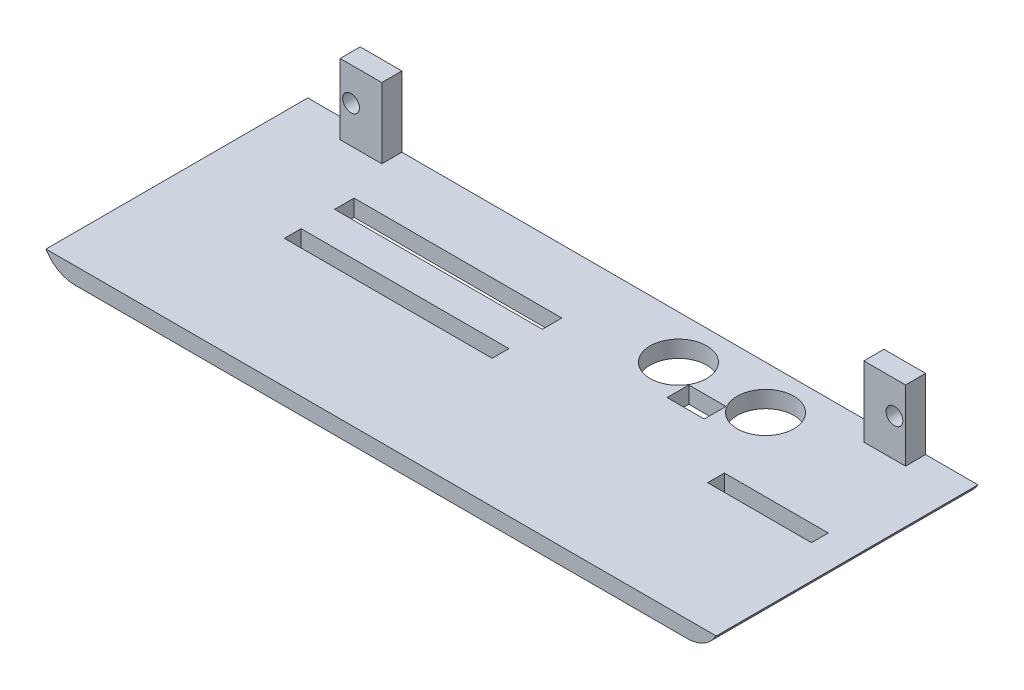
ISO-10303-21;
HEADER;
FILE_DESCRIPTION(('STEP AP214'),'2;1');
FILE_NAME('part.step','',(''),(''),'','','');
FILE_SCHEMA(('AUTOMOTIVE_DESIGN { 1 0 10303 214 1 1 1 1 }'));
ENDSEC;
DATA;
#1=APPLICATION_CONTEXT('core data for automotive mechanical design processes');
#2=APPLICATION_PROTOCOL_DEFINITION('international standard','automotive_design',2000,#1);
#3=PRODUCT_CONTEXT('',#1,'mechanical');
#4=PRODUCT('Part','Part','',(#3));
#5=PRODUCT_RELATED_PRODUCT_CATEGORY('part','',(#4));
#6=PRODUCT_DEFINITION_FORMATION('','',#4);
#7=PRODUCT_DEFINITION_CONTEXT('part definition',#1,'design');
#8=PRODUCT_DEFINITION('design','',#6,#7);
#9=PRODUCT_DEFINITION_SHAPE('','',#8);
#10=(LENGTH_UNIT() NAMED_UNIT(*) SI_UNIT(.MILLI.,.METRE.));
#11=(NAMED_UNIT(*) PLANE_ANGLE_UNIT() SI_UNIT($,.RADIAN.));
#12=(NAMED_UNIT(*) SI_UNIT($,.STERADIAN.) SOLID_ANGLE_UNIT());
#13=UNCERTAINTY_MEASURE_WITH_UNIT(LENGTH_MEASURE(1.E-05),#10,'distance_accuracy_value','');
#14=(GEOMETRIC_REPRESENTATION_CONTEXT(3) GLOBAL_UNCERTAINTY_ASSIGNED_CONTEXT((#13)) GLOBAL_UNIT_ASSIGNED_CONTEXT((#10,
#11,#12)) REPRESENTATION_CONTEXT('',''));
#15=CARTESIAN_POINT('',(0.,0.,0.));
#16=DIRECTION('',(0.,0.,1.));
#17=DIRECTION('',(1.,0.,0.));
#18=AXIS2_PLACEMENT_3D('',#15,#16,#17);
#19=CARTESIAN_POINT('',(0.,-70.3600814497254,0.));
#20=DIRECTION('',(0.,1.,0.));
#21=DIRECTION('',(0.,0.,1.));
#22=AXIS2_PLACEMENT_3D('',#19,#20,#21);
#23=PLANE('',#22);
#24=DIRECTION('',(0.,0.,1.));
#25=VECTOR('',#24,1.);
#26=CARTESIAN_POINT('',(31.1682634673812,-70.3600814497254,0.));
#27=LINE('',#26,#25);
#28=CARTESIAN_POINT('',(31.1682634673812,-70.3600814497254,19.34));
#29=VERTEX_POINT('',#28);
#30=CARTESIAN_POINT('',(31.1682634673812,-70.3600814497254,25.84));
#31=VERTEX_POINT('',#30);
#32=EDGE_CURVE('E240',#29,#31,#27,.T.);
#33=ORIENTED_EDGE('',*,*,#32,.F.);
#34=DIRECTION('',(-1.,0.,0.));
#35=VECTOR('',#34,1.);
#36=CARTESIAN_POINT('',(0.,-70.3600814497254,19.34));
#37=LINE('',#36,#35);
#38=CARTESIAN_POINT('',(42.2482634673812,-70.3600814497254,19.34));
#39=VERTEX_POINT('',#38);
#40=EDGE_CURVE('E278',#39,#29,#37,.T.);
#41=ORIENTED_EDGE('',*,*,#40,.F.);
#42=DIRECTION('',(0.,0.,-1.));
#43=VECTOR('',#42,1.);
#44=CARTESIAN_POINT('',(42.2482634673812,-70.3600814497254,0.));
#45=LINE('',#44,#43);
#46=CARTESIAN_POINT('',(42.2482634673812,-70.3600814497254,25.84));
#47=VERTEX_POINT('',#46);
#48=EDGE_CURVE('E250',#47,#39,#45,.T.);
#49=ORIENTED_EDGE('',*,*,#48,.F.);
#50=DIRECTION('',(1.,0.,0.));
#51=VECTOR('',#50,1.);
#52=CARTESIAN_POINT('',(0.,-70.3600814497254,25.84));
#53=LINE('',#52,#51);
#54=EDGE_CURVE('E267',#31,#47,#53,.T.);
#55=ORIENTED_EDGE('',*,*,#54,.F.);
#56=EDGE_LOOP('',(#33,#41,#49,#55));
#57=FACE_BOUND('',#56,.T.);
#58=CARTESIAN_POINT('',(49.7082634673812,-70.3600814497254,15.));
#59=DIRECTION('',(0.,1.,0.));
#60=DIRECTION('',(0.,0.,1.));
#61=AXIS2_PLACEMENT_3D('',#58,#59,#60);
#62=CIRCLE('',#61,8.45);
#63=CARTESIAN_POINT('',(49.7082634673812,-70.3600814497254,23.45));
#64=VERTEX_POINT('',#63);
#65=EDGE_CURVE('E280',#64,#64,#62,.T.);
#66=ORIENTED_EDGE('',*,*,#65,.F.);
#67=EDGE_LOOP('',(#66));
#68=FACE_BOUND('',#67,.T.);
#69=CARTESIAN_POINT('',(23.7082634673812,-70.3600814497254,15.));
#70=DIRECTION('',(0.,1.,0.));
#71=DIRECTION('',(0.,0.,1.));
#72=AXIS2_PLACEMENT_3D('',#69,#70,#71);
#73=CIRCLE('',#72,8.44999999999999);
#74=CARTESIAN_POINT('',(23.7082634673812,-70.3600814497254,23.45));
#75=VERTEX_POINT('',#74);
#76=EDGE_CURVE('E275',#75,#75,#73,.T.);
#77=ORIENTED_EDGE('',*,*,#76,.F.);
#78=EDGE_LOOP('',(#77));
#79=FACE_BOUND('',#78,.T.);
#80=DIRECTION('',(0.,0.,1.));
#81=VECTOR('',#80,1.);
#82=CARTESIAN_POINT('',(-67.0917365326188,-70.3600814497254,0.));
#83=LINE('',#82,#81);
#84=CARTESIAN_POINT('',(-67.0917365326188,-70.3600814497254,20.991451354897));
#85=VERTEX_POINT('',#84);
#86=CARTESIAN_POINT('',(-67.0917365326188,-70.3600814497254,26.791451354897));
#87=VERTEX_POINT('',#86);
#88=EDGE_CURVE('E11',#85,#87,#83,.T.);
#89=ORIENTED_EDGE('',*,*,#88,.F.);
#90=DIRECTION('',(-1.,0.,0.));
#91=VECTOR('',#90,1.);
#92=CARTESIAN_POINT('',(0.,-70.3600814497254,20.991451354897));
#93=LINE('',#92,#91);
#94=CARTESIAN_POINT('',(-5.09173653261875,-70.3600814497254,20.991451354897));
#95=VERTEX_POINT('',#94);
#96=EDGE_CURVE('E461',#95,#85,#93,.T.);
#97=ORIENTED_EDGE('',*,*,#96,.F.);
#98=DIRECTION('',(0.,0.,-1.));
#99=VECTOR('',#98,1.);
#100=CARTESIAN_POINT('',(-5.09173653261875,-70.3600814497254,0.));
#101=LINE('',#100,#99);
#102=CARTESIAN_POINT('',(-5.09173653261875,-70.3600814497254,26.791451354897));
#103=VERTEX_POINT('',#102);
#104=EDGE_CURVE('E463',#103,#95,#101,.T.);
#105=ORIENTED_EDGE('',*,*,#104,.F.);
#106=DIRECTION('',(1.,0.,0.));
#107=VECTOR('',#106,1.);
#108=CARTESIAN_POINT('',(0.,-70.3600814497254,26.791451354897));
#109=LINE('',#108,#107);
#110=EDGE_CURVE('E52',#87,#103,#109,.T.);
#111=ORIENTED_EDGE('',*,*,#110,.F.);
#112=EDGE_LOOP('',(#89,#97,#105,#111));
#113=FACE_BOUND('',#112,.T.);
#114=DIRECTION('',(0.,0.,1.));
#115=VECTOR('',#114,1.);
#116=CARTESIAN_POINT('',(-67.0917365326188,-70.3600814497254,0.));
#117=LINE('',#116,#115);
#118=CARTESIAN_POINT('',(-67.0917365326188,-70.3600814497254,36.791451354897));
#119=VERTEX_POINT('',#118);
#120=CARTESIAN_POINT('',(-67.0917365326188,-70.3600814497254,41.791451354897));
#121=VERTEX_POINT('',#120);
#122=EDGE_CURVE('E459',#119,#121,#117,.T.);
#123=ORIENTED_EDGE('',*,*,#122,.F.);
#124=DIRECTION('',(-1.,0.,0.));
#125=VECTOR('',#124,1.);
#126=CARTESIAN_POINT('',(0.,-70.3600814497254,36.791451354897));
#127=LINE('',#126,#125);
#128=CARTESIAN_POINT('',(-5.09173653261875,-70.3600814497254,36.791451354897));
#129=VERTEX_POINT('',#128);
#130=EDGE_CURVE('E452',#129,#119,#127,.T.);
#131=ORIENTED_EDGE('',*,*,#130,.F.);
#132=DIRECTION('',(0.,0.,-1.));
#133=VECTOR('',#132,1.);
#134=CARTESIAN_POINT('',(-5.09173653261875,-70.3600814497254,0.));
#135=LINE('',#134,#133);
#136=CARTESIAN_POINT('',(-5.09173653261875,-70.3600814497254,41.791451354897));
#137=VERTEX_POINT('',#136);
#138=EDGE_CURVE('E454',#137,#129,#135,.T.);
#139=ORIENTED_EDGE('',*,*,#138,.F.);
#140=DIRECTION('',(1.,0.,0.));
#141=VECTOR('',#140,1.);
#142=CARTESIAN_POINT('',(0.,-70.3600814497254,41.791451354897));
#143=LINE('',#142,#141);
#144=EDGE_CURVE('E457',#121,#137,#143,.T.);
#145=ORIENTED_EDGE('',*,*,#144,.F.);
#146=EDGE_LOOP('',(#123,#131,#139,#145));
#147=FACE_BOUND('',#146,.T.);
#148=DIRECTION('',(0.,0.,1.));
#149=VECTOR('',#148,1.);
#150=CARTESIAN_POINT('',(59.2082634673812,-70.3600814497254,0.));
#151=LINE('',#150,#149);
#152=CARTESIAN_POINT('',(59.2082634673812,-70.3600814497254,36.791451354897));
#153=VERTEX_POINT('',#152);
#154=CARTESIAN_POINT('',(59.2082634673812,-70.3600814497254,41.791451354897));
#155=VERTEX_POINT('',#154);
#156=EDGE_CURVE('E450',#153,#155,#151,.T.);
#157=ORIENTED_EDGE('',*,*,#156,.F.);
#158=DIRECTION('',(-1.,0.,0.));
#159=VECTOR('',#158,1.);
#160=CARTESIAN_POINT('',(0.,-70.3600814497254,36.791451354897));
#161=LINE('',#160,#159);
#162=CARTESIAN_POINT('',(90.2082634673812,-70.3600814497254,36.791451354897));
#163=VERTEX_POINT('',#162);
#164=EDGE_CURVE('E443',#163,#153,#161,.T.);
#165=ORIENTED_EDGE('',*,*,#164,.F.);
#166=DIRECTION('',(0.,0.,-1.));
#167=VECTOR('',#166,1.);
#168=CARTESIAN_POINT('',(90.2082634673812,-70.3600814497254,0.));
#169=LINE('',#168,#167);
#170=CARTESIAN_POINT('',(90.2082634673812,-70.3600814497254,41.791451354897));
#171=VERTEX_POINT('',#170);
#172=EDGE_CURVE('E445',#171,#163,#169,.T.);
#173=ORIENTED_EDGE('',*,*,#172,.F.);
#174=DIRECTION('',(1.,0.,0.));
#175=VECTOR('',#174,1.);
#176=CARTESIAN_POINT('',(0.,-70.3600814497254,41.791451354897));
#177=LINE('',#176,#175);
#178=EDGE_CURVE('E448',#155,#171,#177,.T.);
#179=ORIENTED_EDGE('',*,*,#178,.F.);
#180=EDGE_LOOP('',(#157,#165,#173,#179));
#181=FACE_BOUND('',#180,.T.);
#182=DIRECTION('',(1.,0.,0.));
#183=VECTOR('',#182,1.);
#184=CARTESIAN_POINT('',(-84.2614737983851,-70.3600814497254,7.99145135489698));
#185=LINE('',#184,#183);
#186=CARTESIAN_POINT('',(-84.2614737983851,-70.3600814497254,7.99145135489698));
#187=VERTEX_POINT('',#186);
#188=CARTESIAN_POINT('',(-71.8189005757376,-70.3600814497254,7.99145135489698));
#189=VERTEX_POINT('',#188);
#190=EDGE_CURVE('E289',#187,#189,#185,.T.);
#191=ORIENTED_EDGE('',*,*,#190,.F.);
#192=DIRECTION('',(0.,0.,1.));
#193=VECTOR('',#192,1.);
#194=CARTESIAN_POINT('',(-84.2614737983851,-70.3600814497254,0.));
#195=LINE('',#194,#193);
#196=CARTESIAN_POINT('',(-84.2614737983851,-70.3600814497254,2.));
#197=VERTEX_POINT('',#196);
#198=EDGE_CURVE('E414',#197,#187,#195,.T.);
#199=ORIENTED_EDGE('',*,*,#198,.F.);
#200=DIRECTION('',(1.,0.,0.));
#201=VECTOR('',#200,1.);
#202=CARTESIAN_POINT('',(-99.8917365326188,-70.3600814497254,2.));
#203=LINE('',#202,#201);
#204=CARTESIAN_POINT('',(-99.8917365326188,-70.3600814497254,2.));
#205=VERTEX_POINT('',#204);
#206=EDGE_CURVE('E407',#205,#197,#203,.T.);
#207=ORIENTED_EDGE('',*,*,#206,.F.);
#208=DIRECTION('',(0.,0.,-1.));
#209=VECTOR('',#208,1.);
#210=CARTESIAN_POINT('',(-99.8917365326188,-70.3600814497254,2.));
#211=LINE('',#210,#209);
#212=CARTESIAN_POINT('',(-99.8917365326188,-70.3600814497254,80.1241320149708));
#213=VERTEX_POINT('',#212);
#214=EDGE_CURVE('E402',#213,#205,#211,.T.);
#215=ORIENTED_EDGE('',*,*,#214,.F.);
#216=DIRECTION('',(-1.,0.,0.));
#217=VECTOR('',#216,1.);
#218=CARTESIAN_POINT('',(-99.8917365326188,-70.3600814497254,80.1241320149708));
#219=LINE('',#218,#217);
#220=CARTESIAN_POINT('',(100.108263467381,-70.3600814497254,80.1241320149708));
#221=VERTEX_POINT('',#220);
#222=EDGE_CURVE('E412',#221,#213,#219,.T.);
#223=ORIENTED_EDGE('',*,*,#222,.F.);
#224=DIRECTION('',(0.,0.,1.));
#225=VECTOR('',#224,1.);
#226=CARTESIAN_POINT('',(100.108263467381,-70.3600814497254,2.));
#227=LINE('',#226,#225);
#228=CARTESIAN_POINT('',(100.108263467381,-70.3600814497254,2.));
#229=VERTEX_POINT('',#228);
#230=EDGE_CURVE('E409',#229,#221,#227,.T.);
#231=ORIENTED_EDGE('',*,*,#230,.F.);
#232=CARTESIAN_POINT('',(84.4780007331477,-70.3600814497254,2.));
#233=VERTEX_POINT('',#232);
#234=EDGE_CURVE('E405',#233,#229,#203,.T.);
#235=ORIENTED_EDGE('',*,*,#234,.F.);
#236=DIRECTION('',(0.,0.,-1.));
#237=VECTOR('',#236,1.);
#238=CARTESIAN_POINT('',(84.4780007331477,-70.3600814497254,0.));
#239=LINE('',#238,#237);
#240=CARTESIAN_POINT('',(84.4780007331477,-70.3600814497254,7.99145135489701));
#241=VERTEX_POINT('',#240);
#242=EDGE_CURVE('E419',#241,#233,#239,.T.);
#243=ORIENTED_EDGE('',*,*,#242,.F.);
#244=DIRECTION('',(1.,0.,0.));
#245=VECTOR('',#244,1.);
#246=CARTESIAN_POINT('',(72.0354275105001,-70.3600814497254,7.99145135489701));
#247=LINE('',#246,#245);
#248=CARTESIAN_POINT('',(72.0354275105001,-70.3600814497254,7.99145135489701));
#249=VERTEX_POINT('',#248);
#250=EDGE_CURVE('E316',#249,#241,#247,.T.);
#251=ORIENTED_EDGE('',*,*,#250,.F.);
#252=DIRECTION('',(0.,0.,1.));
#253=VECTOR('',#252,1.);
#254=CARTESIAN_POINT('',(72.0354275105001,-70.3600814497254,2.));
#255=LINE('',#254,#253);
#256=CARTESIAN_POINT('',(72.0354275105001,-70.3600814497254,2.));
#257=VERTEX_POINT('',#256);
#258=EDGE_CURVE('E336',#257,#249,#255,.T.);
#259=ORIENTED_EDGE('',*,*,#258,.F.);
#260=CARTESIAN_POINT('',(-71.8189005757376,-70.3600814497254,2.));
#261=VERTEX_POINT('',#260);
#262=EDGE_CURVE('E59',#261,#257,#203,.T.);
#263=ORIENTED_EDGE('',*,*,#262,.F.);
#264=DIRECTION('',(0.,0.,-1.));
#265=VECTOR('',#264,1.);
#266=CARTESIAN_POINT('',(-71.8189005757376,-70.3600814497254,2.));
#267=LINE('',#266,#265);
#268=EDGE_CURVE('E308',#189,#261,#267,.T.);
#269=ORIENTED_EDGE('',*,*,#268,.F.);
#270=EDGE_LOOP('',(#191,#199,#207,#215,#223,#231,#235,#243,#251,#259,#263,#269));
#271=FACE_BOUND('',#270,.T.);
#272=ADVANCED_FACE('F44',(#57,#68,#79,#113,#147,#181,#271),#23,.T.);
#273=CARTESIAN_POINT('',(-99.8917365326188,-75.3600814497254,2.));
#274=DIRECTION('',(0.,1.,0.));
#275=DIRECTION('',(0.,0.,1.));
#276=AXIS2_PLACEMENT_3D('',#273,#274,#275);
#277=PLANE('',#276);
#278=CARTESIAN_POINT('',(49.7082634673812,-75.3600814497254,15.));
#279=DIRECTION('',(0.,-1.,0.));
#280=DIRECTION('',(0.,0.,-1.));
#281=AXIS2_PLACEMENT_3D('',#278,#279,#280);
#282=CIRCLE('',#281,8.45);
#283=CARTESIAN_POINT('',(49.7082634673812,-75.3600814497254,6.55));
#284=VERTEX_POINT('',#283);
#285=EDGE_CURVE('E239',#284,#284,#282,.T.);
#286=ORIENTED_EDGE('',*,*,#285,.F.);
#287=EDGE_LOOP('',(#286));
#288=FACE_BOUND('',#287,.T.);
#289=DIRECTION('',(1.,0.,0.));
#290=VECTOR('',#289,1.);
#291=CARTESIAN_POINT('',(31.7082634673812,-75.3600814497254,19.34));
#292=LINE('',#291,#290);
#293=CARTESIAN_POINT('',(31.1682634673812,-75.3600814497254,19.34));
#294=VERTEX_POINT('',#293);
#295=CARTESIAN_POINT('',(42.2482634673812,-75.3600814497254,19.34));
#296=VERTEX_POINT('',#295);
#297=EDGE_CURVE('E229',#294,#296,#292,.T.);
#298=ORIENTED_EDGE('',*,*,#297,.F.);
#299=DIRECTION('',(0.,0.,-1.));
#300=VECTOR('',#299,1.);
#301=CARTESIAN_POINT('',(31.1682634673812,-75.3600814497254,19.34));
#302=LINE('',#301,#300);
#303=CARTESIAN_POINT('',(31.1682634673812,-75.3600814497254,25.84));
#304=VERTEX_POINT('',#303);
#305=EDGE_CURVE('E252',#304,#294,#302,.T.);
#306=ORIENTED_EDGE('',*,*,#305,.F.);
#307=DIRECTION('',(-1.,0.,0.));
#308=VECTOR('',#307,1.);
#309=CARTESIAN_POINT('',(31.1682634673812,-75.3600814497254,25.84));
#310=LINE('',#309,#308);
#311=CARTESIAN_POINT('',(42.2482634673812,-75.3600814497254,25.84));
#312=VERTEX_POINT('',#311);
#313=EDGE_CURVE('E257',#312,#304,#310,.T.);
#314=ORIENTED_EDGE('',*,*,#313,.F.);
#315=DIRECTION('',(0.,0.,1.));
#316=VECTOR('',#315,1.);
#317=CARTESIAN_POINT('',(42.2482634673812,-75.3600814497254,19.34));
#318=LINE('',#317,#316);
#319=EDGE_CURVE('E247',#296,#312,#318,.T.);
#320=ORIENTED_EDGE('',*,*,#319,.F.);
#321=EDGE_LOOP('',(#298,#306,#314,#320));
#322=FACE_BOUND('',#321,.T.);
#323=CARTESIAN_POINT('',(23.7082634673812,-75.3600814497254,15.));
#324=DIRECTION('',(0.,-1.,0.));
#325=DIRECTION('',(0.,0.,-1.));
#326=AXIS2_PLACEMENT_3D('',#323,#324,#325);
#327=CIRCLE('',#326,8.44999999999999);
#328=CARTESIAN_POINT('',(23.7082634673812,-75.3600814497254,6.55000000000001));
#329=VERTEX_POINT('',#328);
#330=EDGE_CURVE('E272',#329,#329,#327,.T.);
#331=ORIENTED_EDGE('',*,*,#330,.F.);
#332=EDGE_LOOP('',(#331));
#333=FACE_BOUND('',#332,.T.);
#334=DIRECTION('',(1.,0.,0.));
#335=VECTOR('',#334,1.);
#336=CARTESIAN_POINT('',(-67.0917365326188,-75.3600814497254,20.991451354897));
#337=LINE('',#336,#335);
#338=CARTESIAN_POINT('',(-67.0917365326188,-75.3600814497254,20.991451354897));
#339=VERTEX_POINT('',#338);
#340=CARTESIAN_POINT('',(-5.09173653261875,-75.3600814497254,20.991451354897));
#341=VERTEX_POINT('',#340);
#342=EDGE_CURVE('E340',#339,#341,#337,.T.);
#343=ORIENTED_EDGE('',*,*,#342,.F.);
#344=DIRECTION('',(0.,0.,-1.));
#345=VECTOR('',#344,1.);
#346=CARTESIAN_POINT('',(-67.0917365326188,-75.3600814497254,26.791451354897));
#347=LINE('',#346,#345);
#348=CARTESIAN_POINT('',(-67.0917365326188,-75.3600814497254,26.791451354897));
#349=VERTEX_POINT('',#348);
#350=EDGE_CURVE('E67',#349,#339,#347,.T.);
#351=ORIENTED_EDGE('',*,*,#350,.F.);
#352=DIRECTION('',(-1.,0.,0.));
#353=VECTOR('',#352,1.);
#354=CARTESIAN_POINT('',(-67.0917365326188,-75.3600814497254,26.791451354897));
#355=LINE('',#354,#353);
#356=CARTESIAN_POINT('',(-5.09173653261875,-75.3600814497254,26.791451354897));
#357=VERTEX_POINT('',#356);
#358=EDGE_CURVE('E347',#357,#349,#355,.T.);
#359=ORIENTED_EDGE('',*,*,#358,.F.);
#360=DIRECTION('',(0.,0.,1.));
#361=VECTOR('',#360,1.);
#362=CARTESIAN_POINT('',(-5.09173653261875,-75.3600814497254,26.791451354897));
#363=LINE('',#362,#361);
#364=EDGE_CURVE('E344',#341,#357,#363,.T.);
#365=ORIENTED_EDGE('',*,*,#364,.F.);
#366=EDGE_LOOP('',(#343,#351,#359,#365));
#367=FACE_BOUND('',#366,.T.);
#368=DIRECTION('',(1.,0.,0.));
#369=VECTOR('',#368,1.);
#370=CARTESIAN_POINT('',(-67.0917365326188,-75.3600814497254,36.791451354897));
#371=LINE('',#370,#369);
#372=CARTESIAN_POINT('',(-67.0917365326188,-75.3600814497254,36.791451354897));
#373=VERTEX_POINT('',#372);
#374=CARTESIAN_POINT('',(-5.09173653261875,-75.3600814497254,36.791451354897));
#375=VERTEX_POINT('',#374);
#376=EDGE_CURVE('E375',#373,#375,#371,.T.);
#377=ORIENTED_EDGE('',*,*,#376,.F.);
#378=DIRECTION('',(0.,0.,-1.));
#379=VECTOR('',#378,1.);
#380=CARTESIAN_POINT('',(-67.0917365326188,-75.3600814497254,36.791451354897));
#381=LINE('',#380,#379);
#382=CARTESIAN_POINT('',(-67.0917365326188,-75.3600814497254,41.791451354897));
#383=VERTEX_POINT('',#382);
#384=EDGE_CURVE('E341',#383,#373,#381,.T.);
#385=ORIENTED_EDGE('',*,*,#384,.F.);
#386=DIRECTION('',(-1.,0.,0.));
#387=VECTOR('',#386,1.);
#388=CARTESIAN_POINT('',(-67.0917365326188,-75.3600814497254,41.791451354897));
#389=LINE('',#388,#387);
#390=CARTESIAN_POINT('',(-5.09173653261875,-75.3600814497254,41.791451354897));
#391=VERTEX_POINT('',#390);
#392=EDGE_CURVE('E362',#391,#383,#389,.T.);
#393=ORIENTED_EDGE('',*,*,#392,.F.);
#394=DIRECTION('',(0.,0.,1.));
#395=VECTOR('',#394,1.);
#396=CARTESIAN_POINT('',(-5.09173653261875,-75.3600814497254,36.791451354897));
#397=LINE('',#396,#395);
#398=EDGE_CURVE('E372',#375,#391,#397,.T.);
#399=ORIENTED_EDGE('',*,*,#398,.F.);
#400=EDGE_LOOP('',(#377,#385,#393,#399));
#401=FACE_BOUND('',#400,.T.);
#402=DIRECTION('',(1.,0.,0.));
#403=VECTOR('',#402,1.);
#404=CARTESIAN_POINT('',(59.2082634673812,-75.3600814497254,36.791451354897));
#405=LINE('',#404,#403);
#406=CARTESIAN_POINT('',(59.2082634673812,-75.3600814497254,36.791451354897));
#407=VERTEX_POINT('',#406);
#408=CARTESIAN_POINT('',(90.2082634673812,-75.3600814497254,36.791451354897));
#409=VERTEX_POINT('',#408);
#410=EDGE_CURVE('E393',#407,#409,#405,.T.);
#411=ORIENTED_EDGE('',*,*,#410,.F.);
#412=DIRECTION('',(0.,0.,-1.));
#413=VECTOR('',#412,1.);
#414=CARTESIAN_POINT('',(59.2082634673812,-75.3600814497254,36.791451354897));
#415=LINE('',#414,#413);
#416=CARTESIAN_POINT('',(59.2082634673812,-75.3600814497254,41.791451354897));
#417=VERTEX_POINT('',#416);
#418=EDGE_CURVE('E369',#417,#407,#415,.T.);
#419=ORIENTED_EDGE('',*,*,#418,.F.);
#420=DIRECTION('',(-1.,0.,0.));
#421=VECTOR('',#420,1.);
#422=CARTESIAN_POINT('',(59.2082634673812,-75.3600814497254,41.791451354897));
#423=LINE('',#422,#421);
#424=CARTESIAN_POINT('',(90.2082634673812,-75.3600814497254,41.791451354897));
#425=VERTEX_POINT('',#424);
#426=EDGE_CURVE('E382',#425,#417,#423,.T.);
#427=ORIENTED_EDGE('',*,*,#426,.F.);
#428=DIRECTION('',(0.,0.,1.));
#429=VECTOR('',#428,1.);
#430=CARTESIAN_POINT('',(90.2082634673812,-75.3600814497254,36.791451354897));
#431=LINE('',#430,#429);
#432=EDGE_CURVE('E390',#409,#425,#431,.T.);
#433=ORIENTED_EDGE('',*,*,#432,.F.);
#434=EDGE_LOOP('',(#411,#419,#427,#433));
#435=FACE_BOUND('',#434,.T.);
#436=DIRECTION('',(0.,0.,-1.));
#437=VECTOR('',#436,1.);
#438=CARTESIAN_POINT('',(-91.2314824947744,-75.3600814497254,2.));
#439=LINE('',#438,#437);
#440=CARTESIAN_POINT('',(-91.2314824947744,-75.3600814497254,80.1241320149708));
#441=VERTEX_POINT('',#440);
#442=CARTESIAN_POINT('',(-91.2314824947744,-75.3600814497254,2.));
#443=VERTEX_POINT('',#442);
#444=EDGE_CURVE('E428',#441,#443,#439,.T.);
#445=ORIENTED_EDGE('',*,*,#444,.T.);
#446=DIRECTION('',(1.,0.,0.));
#447=VECTOR('',#446,1.);
#448=CARTESIAN_POINT('',(-99.8917365326188,-75.3600814497254,2.));
#449=LINE('',#448,#447);
#450=CARTESIAN_POINT('',(91.4480094295369,-75.3600814497254,2.));
#451=VERTEX_POINT('',#450);
#452=EDGE_CURVE('E401',#443,#451,#449,.T.);
#453=ORIENTED_EDGE('',*,*,#452,.T.);
#454=DIRECTION('',(0.,0.,1.));
#455=VECTOR('',#454,1.);
#456=CARTESIAN_POINT('',(91.4480094295369,-75.3600814497254,2.));
#457=LINE('',#456,#455);
#458=CARTESIAN_POINT('',(91.4480094295369,-75.3600814497254,80.1241320149708));
#459=VERTEX_POINT('',#458);
#460=EDGE_CURVE('E431',#451,#459,#457,.T.);
#461=ORIENTED_EDGE('',*,*,#460,.T.);
#462=DIRECTION('',(-1.,0.,0.));
#463=VECTOR('',#462,1.);
#464=CARTESIAN_POINT('',(-99.8917365326188,-75.3600814497254,80.1241320149708));
#465=LINE('',#464,#463);
#466=EDGE_CURVE('E406',#459,#441,#465,.T.);
#467=ORIENTED_EDGE('',*,*,#466,.T.);
#468=EDGE_LOOP('',(#445,#453,#461,#467));
#469=FACE_BOUND('',#468,.T.);
#470=ADVANCED_FACE('F254',(#288,#322,#333,#367,#401,#435,#469),#277,.F.);
#471=CARTESIAN_POINT('',(-84.2614737983851,-54.3600814497254,2.));
#472=DIRECTION('',(-1.,0.,0.));
#473=DIRECTION('',(0.,0.,1.));
#474=AXIS2_PLACEMENT_3D('',#471,#472,#473);
#475=PLANE('',#474);
#476=ORIENTED_EDGE('',*,*,#198,.T.);
#477=DIRECTION('',(0.,-1.,0.));
#478=VECTOR('',#477,1.);
#479=CARTESIAN_POINT('',(-84.2614737983851,-49.3600814497254,7.99145135489698));
#480=LINE('',#479,#478);
#481=CARTESIAN_POINT('',(-84.2614737983851,-49.3600814497254,7.99145135489698));
#482=VERTEX_POINT('',#481);
#483=EDGE_CURVE('E286',#482,#187,#480,.T.);
#484=ORIENTED_EDGE('',*,*,#483,.F.);
#485=DIRECTION('',(0.,0.,1.));
#486=VECTOR('',#485,1.);
#487=CARTESIAN_POINT('',(-84.2614737983851,-49.3600814497254,2.));
#488=LINE('',#487,#486);
#489=CARTESIAN_POINT('',(-84.2614737983851,-49.3600814497254,2.));
#490=VERTEX_POINT('',#489);
#491=EDGE_CURVE('E298',#490,#482,#488,.T.);
#492=ORIENTED_EDGE('',*,*,#491,.F.);
#493=DIRECTION('',(0.,-1.,0.));
#494=VECTOR('',#493,1.);
#495=CARTESIAN_POINT('',(-84.2614737983851,-54.3600814497254,2.));
#496=LINE('',#495,#494);
#497=EDGE_CURVE('E353',#490,#197,#496,.T.);
#498=ORIENTED_EDGE('',*,*,#497,.T.);
#499=EDGE_LOOP('',(#476,#484,#492,#498));
#500=FACE_BOUND('',#499,.T.);
#501=ADVANCED_FACE('F486',(#500),#475,.T.);
#502=CARTESIAN_POINT('',(84.4780007331477,-54.3600814497254,2.00000000000003));
#503=DIRECTION('',(1.,0.,0.));
#504=DIRECTION('',(0.,0.,-1.));
#505=AXIS2_PLACEMENT_3D('',#502,#503,#504);
#506=PLANE('',#505);
#507=ORIENTED_EDGE('',*,*,#242,.T.);
#508=DIRECTION('',(0.,1.,0.));
#509=VECTOR('',#508,1.);
#510=CARTESIAN_POINT('',(84.4780007331477,-54.3600814497254,2.));
#511=LINE('',#510,#509);
#512=CARTESIAN_POINT('',(84.4780007331477,-49.3600814497254,2.));
#513=VERTEX_POINT('',#512);
#514=EDGE_CURVE('E399',#233,#513,#511,.T.);
#515=ORIENTED_EDGE('',*,*,#514,.T.);
#516=DIRECTION('',(0.,0.,-1.));
#517=VECTOR('',#516,1.);
#518=CARTESIAN_POINT('',(84.4780007331477,-49.3600814497254,2.));
#519=LINE('',#518,#517);
#520=CARTESIAN_POINT('',(84.4780007331477,-49.3600814497254,7.99145135489701));
#521=VERTEX_POINT('',#520);
#522=EDGE_CURVE('E327',#521,#513,#519,.T.);
#523=ORIENTED_EDGE('',*,*,#522,.F.);
#524=DIRECTION('',(0.,1.,0.));
#525=VECTOR('',#524,1.);
#526=CARTESIAN_POINT('',(84.4780007331477,-49.3600814497254,7.99145135489701));
#527=LINE('',#526,#525);
#528=EDGE_CURVE('E319',#241,#521,#527,.T.);
#529=ORIENTED_EDGE('',*,*,#528,.F.);
#530=EDGE_LOOP('',(#507,#515,#523,#529));
#531=FACE_BOUND('',#530,.T.);
#532=ADVANCED_FACE('F570',(#531),#506,.T.);
#533=CARTESIAN_POINT('',(81.1660259640243,-59.0513852245509,0.));
#534=DIRECTION('',(0.,0.,1.));
#535=DIRECTION('',(1.,0.,0.));
#536=AXIS2_PLACEMENT_3D('',#533,#534,#535);
#537=CYLINDRICAL_SURFACE('',#536,2.50000000000002);
#538=CARTESIAN_POINT('',(81.1660259640243,-59.0513852245509,2.00000000000003));
#539=DIRECTION('',(0.,0.,-1.));
#540=DIRECTION('',(-1.,0.,0.));
#541=AXIS2_PLACEMENT_3D('',#538,#539,#540);
#542=CIRCLE('',#541,2.50000000000002);
#543=CARTESIAN_POINT('',(78.6660259640243,-59.0513852245509,2.00000000000003));
#544=VERTEX_POINT('',#543);
#545=EDGE_CURVE('E422',#544,#544,#542,.T.);
#546=ORIENTED_EDGE('',*,*,#545,.T.);
#547=EDGE_LOOP('',(#546));
#548=FACE_BOUND('',#547,.T.);
#549=CARTESIAN_POINT('',(81.1660259640243,-59.0513852245509,7.99145135489701));
#550=DIRECTION('',(0.,0.,1.));
#551=DIRECTION('',(1.,0.,0.));
#552=AXIS2_PLACEMENT_3D('',#549,#550,#551);
#553=CIRCLE('',#552,2.50000000000002);
#554=CARTESIAN_POINT('',(83.6660259640243,-59.0513852245509,7.99145135489701));
#555=VERTEX_POINT('',#554);
#556=EDGE_CURVE('E310',#555,#555,#553,.T.);
#557=ORIENTED_EDGE('',*,*,#556,.T.);
#558=EDGE_LOOP('',(#557));
#559=FACE_BOUND('',#558,.T.);
#560=ADVANCED_FACE('F624',(#548,#559),#537,.F.);
#561=CARTESIAN_POINT('',(-80.9960230030784,-59.2843497511423,0.));
#562=DIRECTION('',(0.,0.,1.));
#563=DIRECTION('',(1.,0.,0.));
#564=AXIS2_PLACEMENT_3D('',#561,#562,#563);
#565=CYLINDRICAL_SURFACE('',#564,2.50000000000001);
#566=CARTESIAN_POINT('',(-80.9960230030784,-59.2843497511423,2.));
#567=DIRECTION('',(0.,0.,-1.));
#568=DIRECTION('',(-1.,0.,0.));
#569=AXIS2_PLACEMENT_3D('',#566,#567,#568);
#570=CIRCLE('',#569,2.50000000000001);
#571=CARTESIAN_POINT('',(-83.4960230030784,-59.2843497511423,2.));
#572=VERTEX_POINT('',#571);
#573=EDGE_CURVE('E425',#572,#572,#570,.T.);
#574=ORIENTED_EDGE('',*,*,#573,.T.);
#575=EDGE_LOOP('',(#574));
#576=FACE_BOUND('',#575,.T.);
#577=CARTESIAN_POINT('',(-80.9960230030784,-59.2843497511423,7.99145135489698));
#578=DIRECTION('',(0.,0.,1.));
#579=DIRECTION('',(1.,0.,0.));
#580=AXIS2_PLACEMENT_3D('',#577,#578,#579);
#581=CIRCLE('',#580,2.50000000000001);
#582=CARTESIAN_POINT('',(-78.4960230030784,-59.2843497511423,7.99145135489698));
#583=VERTEX_POINT('',#582);
#584=EDGE_CURVE('E283',#583,#583,#581,.T.);
#585=ORIENTED_EDGE('',*,*,#584,.T.);
#586=EDGE_LOOP('',(#585));
#587=FACE_BOUND('',#586,.T.);
#588=ADVANCED_FACE('F553',(#576,#587),#565,.F.);
#589=CARTESIAN_POINT('',(-99.8917365326188,-70.3600814497254,2.));
#590=DIRECTION('',(0.,0.,-1.));
#591=DIRECTION('',(-1.,0.,0.));
#592=AXIS2_PLACEMENT_3D('',#589,#590,#591);
#593=PLANE('',#592);
#594=DIRECTION('',(0.,1.,0.));
#595=VECTOR('',#594,1.);
#596=CARTESIAN_POINT('',(-71.8189005757376,-70.3600814497254,2.));
#597=LINE('',#596,#595);
#598=CARTESIAN_POINT('',(-71.8189005757376,-49.3600814497254,2.));
#599=VERTEX_POINT('',#598);
#600=EDGE_CURVE('E306',#261,#599,#597,.T.);
#601=ORIENTED_EDGE('',*,*,#600,.F.);
#602=ORIENTED_EDGE('',*,*,#262,.T.);
#603=DIRECTION('',(0.,-1.,0.));
#604=VECTOR('',#603,1.);
#605=CARTESIAN_POINT('',(72.0354275105001,-54.3600814497254,2.));
#606=LINE('',#605,#604);
#607=CARTESIAN_POINT('',(72.0354275105001,-49.3600814497254,2.));
#608=VERTEX_POINT('',#607);
#609=EDGE_CURVE('E333',#608,#257,#606,.T.);
#610=ORIENTED_EDGE('',*,*,#609,.F.);
#611=DIRECTION('',(-1.,0.,0.));
#612=VECTOR('',#611,1.);
#613=CARTESIAN_POINT('',(72.0354275105001,-49.3600814497254,2.));
#614=LINE('',#613,#612);
#615=EDGE_CURVE('E330',#513,#608,#614,.T.);
#616=ORIENTED_EDGE('',*,*,#615,.F.);
#617=ORIENTED_EDGE('',*,*,#514,.F.);
#618=ORIENTED_EDGE('',*,*,#234,.T.);
#619=CARTESIAN_POINT('',(91.4480094295369,-65.3600814497254,2.));
#620=DIRECTION('',(0.,0.,-1.));
#621=DIRECTION('',(-1.,0.,0.));
#622=AXIS2_PLACEMENT_3D('',#619,#620,#621);
#623=CIRCLE('',#622,10.);
#624=EDGE_CURVE('E439',#229,#451,#623,.T.);
#625=ORIENTED_EDGE('',*,*,#624,.T.);
#626=ORIENTED_EDGE('',*,*,#452,.F.);
#627=CARTESIAN_POINT('',(-91.2314824947744,-65.3600814497254,2.));
#628=DIRECTION('',(0.,0.,-1.));
#629=DIRECTION('',(-1.,0.,0.));
#630=AXIS2_PLACEMENT_3D('',#627,#628,#629);
#631=CIRCLE('',#630,10.);
#632=EDGE_CURVE('E441',#443,#205,#631,.T.);
#633=ORIENTED_EDGE('',*,*,#632,.T.);
#634=ORIENTED_EDGE('',*,*,#206,.T.);
#635=ORIENTED_EDGE('',*,*,#497,.F.);
#636=DIRECTION('',(-1.,0.,0.));
#637=VECTOR('',#636,1.);
#638=CARTESIAN_POINT('',(-84.2614737983851,-49.3600814497254,2.));
#639=LINE('',#638,#637);
#640=EDGE_CURVE('E303',#599,#490,#639,.T.);
#641=ORIENTED_EDGE('',*,*,#640,.F.);
#642=EDGE_LOOP('',(#601,#602,#610,#616,#617,#618,#625,#626,#633,#634,#635,#641));
#643=FACE_BOUND('',#642,.T.);
#644=ORIENTED_EDGE('',*,*,#573,.F.);
#645=EDGE_LOOP('',(#644));
#646=FACE_BOUND('',#645,.T.);
#647=ORIENTED_EDGE('',*,*,#545,.F.);
#648=EDGE_LOOP('',(#647));
#649=FACE_BOUND('',#648,.T.);
#650=ADVANCED_FACE('F507',(#643,#646,#649),#593,.T.);
#651=CARTESIAN_POINT('',(-99.8917365326188,-70.3600814497254,80.1241320149708));
#652=DIRECTION('',(0.,0.,1.));
#653=DIRECTION('',(1.,0.,0.));
#654=AXIS2_PLACEMENT_3D('',#651,#652,#653);
#655=PLANE('',#654);
#656=ORIENTED_EDGE('',*,*,#466,.F.);
#657=CARTESIAN_POINT('',(91.4480094295369,-65.3600814497254,80.1241320149708));
#658=DIRECTION('',(0.,0.,1.));
#659=DIRECTION('',(1.,0.,0.));
#660=AXIS2_PLACEMENT_3D('',#657,#658,#659);
#661=CIRCLE('',#660,10.);
#662=EDGE_CURVE('E437',#459,#221,#661,.T.);
#663=ORIENTED_EDGE('',*,*,#662,.T.);
#664=ORIENTED_EDGE('',*,*,#222,.T.);
#665=CARTESIAN_POINT('',(-91.2314824947744,-65.3600814497254,80.1241320149708));
#666=DIRECTION('',(0.,0.,1.));
#667=DIRECTION('',(1.,0.,0.));
#668=AXIS2_PLACEMENT_3D('',#665,#666,#667);
#669=CIRCLE('',#668,10.);
#670=EDGE_CURVE('E434',#213,#441,#669,.T.);
#671=ORIENTED_EDGE('',*,*,#670,.T.);
#672=EDGE_LOOP('',(#656,#663,#664,#671));
#673=FACE_BOUND('',#672,.T.);
#674=ADVANCED_FACE('F547',(#673),#655,.T.);
#675=CARTESIAN_POINT('',(91.4480094295369,-65.3600814497254,2.));
#676=DIRECTION('',(0.,0.,1.));
#677=DIRECTION('',(1.,0.,0.));
#678=AXIS2_PLACEMENT_3D('',#675,#676,#677);
#679=CYLINDRICAL_SURFACE('',#678,10.);
#680=ORIENTED_EDGE('',*,*,#624,.F.);
#681=ORIENTED_EDGE('',*,*,#230,.T.);
#682=ORIENTED_EDGE('',*,*,#662,.F.);
#683=ORIENTED_EDGE('',*,*,#460,.F.);
#684=EDGE_LOOP('',(#680,#681,#682,#683));
#685=FACE_BOUND('',#684,.T.);
#686=ADVANCED_FACE('F550',(#685),#679,.T.);
#687=CARTESIAN_POINT('',(-91.2314824947744,-65.3600814497254,2.));
#688=DIRECTION('',(0.,0.,-1.));
#689=DIRECTION('',(-1.,0.,0.));
#690=AXIS2_PLACEMENT_3D('',#687,#688,#689);
#691=CYLINDRICAL_SURFACE('',#690,10.);
#692=ORIENTED_EDGE('',*,*,#670,.F.);
#693=ORIENTED_EDGE('',*,*,#214,.T.);
#694=ORIENTED_EDGE('',*,*,#632,.F.);
#695=ORIENTED_EDGE('',*,*,#444,.F.);
#696=EDGE_LOOP('',(#692,#693,#694,#695));
#697=FACE_BOUND('',#696,.T.);
#698=ADVANCED_FACE('F46',(#697),#691,.T.);
#699=CARTESIAN_POINT('',(59.2082634673812,-54.3600814497254,36.791451354897));
#700=DIRECTION('',(-1.,0.,0.));
#701=DIRECTION('',(0.,0.,1.));
#702=AXIS2_PLACEMENT_3D('',#699,#700,#701);
#703=PLANE('',#702);
#704=ORIENTED_EDGE('',*,*,#156,.T.);
#705=DIRECTION('',(0.,-1.,0.));
#706=VECTOR('',#705,1.);
#707=CARTESIAN_POINT('',(59.2082634673812,-54.3600814497254,41.791451354897));
#708=LINE('',#707,#706);
#709=EDGE_CURVE('E338',#155,#417,#708,.T.);
#710=ORIENTED_EDGE('',*,*,#709,.T.);
#711=ORIENTED_EDGE('',*,*,#418,.T.);
#712=DIRECTION('',(0.,-1.,0.));
#713=VECTOR('',#712,1.);
#714=CARTESIAN_POINT('',(59.2082634673812,-54.3600814497254,36.791451354897));
#715=LINE('',#714,#713);
#716=EDGE_CURVE('E379',#153,#407,#715,.T.);
#717=ORIENTED_EDGE('',*,*,#716,.F.);
#718=EDGE_LOOP('',(#704,#710,#711,#717));
#719=FACE_BOUND('',#718,.T.);
#720=ADVANCED_FACE('F559',(#719),#703,.F.);
#721=CARTESIAN_POINT('',(59.2082634673812,-54.3600814497254,41.791451354897));
#722=DIRECTION('',(0.,0.,1.));
#723=DIRECTION('',(1.,0.,0.));
#724=AXIS2_PLACEMENT_3D('',#721,#722,#723);
#725=PLANE('',#724);
#726=ORIENTED_EDGE('',*,*,#178,.T.);
#727=DIRECTION('',(0.,-1.,0.));
#728=VECTOR('',#727,1.);
#729=CARTESIAN_POINT('',(90.2082634673812,-54.3600814497254,41.791451354897));
#730=LINE('',#729,#728);
#731=EDGE_CURVE('E385',#171,#425,#730,.T.);
#732=ORIENTED_EDGE('',*,*,#731,.T.);
#733=ORIENTED_EDGE('',*,*,#426,.T.);
#734=ORIENTED_EDGE('',*,*,#709,.F.);
#735=EDGE_LOOP('',(#726,#732,#733,#734));
#736=FACE_BOUND('',#735,.T.);
#737=ADVANCED_FACE('F610',(#736),#725,.F.);
#738=CARTESIAN_POINT('',(90.2082634673812,-54.3600814497254,36.791451354897));
#739=DIRECTION('',(1.,0.,0.));
#740=DIRECTION('',(0.,0.,-1.));
#741=AXIS2_PLACEMENT_3D('',#738,#739,#740);
#742=PLANE('',#741);
#743=ORIENTED_EDGE('',*,*,#172,.T.);
#744=DIRECTION('',(0.,-1.,0.));
#745=VECTOR('',#744,1.);
#746=CARTESIAN_POINT('',(90.2082634673812,-54.3600814497254,36.791451354897));
#747=LINE('',#746,#745);
#748=EDGE_CURVE('E383',#163,#409,#747,.T.);
#749=ORIENTED_EDGE('',*,*,#748,.T.);
#750=ORIENTED_EDGE('',*,*,#432,.T.);
#751=ORIENTED_EDGE('',*,*,#731,.F.);
#752=EDGE_LOOP('',(#743,#749,#750,#751));
#753=FACE_BOUND('',#752,.T.);
#754=ADVANCED_FACE('F614',(#753),#742,.F.);
#755=CARTESIAN_POINT('',(59.2082634673812,-54.3600814497254,36.791451354897));
#756=DIRECTION('',(0.,0.,-1.));
#757=DIRECTION('',(-1.,0.,0.));
#758=AXIS2_PLACEMENT_3D('',#755,#756,#757);
#759=PLANE('',#758);
#760=ORIENTED_EDGE('',*,*,#164,.T.);
#761=ORIENTED_EDGE('',*,*,#716,.T.);
#762=ORIENTED_EDGE('',*,*,#410,.T.);
#763=ORIENTED_EDGE('',*,*,#748,.F.);
#764=EDGE_LOOP('',(#760,#761,#762,#763));
#765=FACE_BOUND('',#764,.T.);
#766=ADVANCED_FACE('F596',(#765),#759,.F.);
#767=CARTESIAN_POINT('',(-67.0917365326188,-54.3600814497254,36.791451354897));
#768=DIRECTION('',(-1.,0.,0.));
#769=DIRECTION('',(0.,0.,1.));
#770=AXIS2_PLACEMENT_3D('',#767,#768,#769);
#771=PLANE('',#770);
#772=ORIENTED_EDGE('',*,*,#122,.T.);
#773=DIRECTION('',(0.,-1.,0.));
#774=VECTOR('',#773,1.);
#775=CARTESIAN_POINT('',(-67.0917365326188,-54.3600814497254,41.791451354897));
#776=LINE('',#775,#774);
#777=EDGE_CURVE('E367',#121,#383,#776,.T.);
#778=ORIENTED_EDGE('',*,*,#777,.T.);
#779=ORIENTED_EDGE('',*,*,#384,.T.);
#780=DIRECTION('',(0.,-1.,0.));
#781=VECTOR('',#780,1.);
#782=CARTESIAN_POINT('',(-67.0917365326188,-54.3600814497254,36.791451354897));
#783=LINE('',#782,#781);
#784=EDGE_CURVE('E359',#119,#373,#783,.T.);
#785=ORIENTED_EDGE('',*,*,#784,.F.);
#786=EDGE_LOOP('',(#772,#778,#779,#785));
#787=FACE_BOUND('',#786,.T.);
#788=ADVANCED_FACE('F592',(#787),#771,.F.);
#789=CARTESIAN_POINT('',(-67.0917365326188,-54.3600814497254,41.791451354897));
#790=DIRECTION('',(0.,0.,1.));
#791=DIRECTION('',(1.,0.,0.));
#792=AXIS2_PLACEMENT_3D('',#789,#790,#791);
#793=PLANE('',#792);
#794=ORIENTED_EDGE('',*,*,#144,.T.);
#795=DIRECTION('',(0.,-1.,0.));
#796=VECTOR('',#795,1.);
#797=CARTESIAN_POINT('',(-5.09173653261875,-54.3600814497254,41.791451354897));
#798=LINE('',#797,#796);
#799=EDGE_CURVE('E365',#137,#391,#798,.T.);
#800=ORIENTED_EDGE('',*,*,#799,.T.);
#801=ORIENTED_EDGE('',*,*,#392,.T.);
#802=ORIENTED_EDGE('',*,*,#777,.F.);
#803=EDGE_LOOP('',(#794,#800,#801,#802));
#804=FACE_BOUND('',#803,.T.);
#805=ADVANCED_FACE('F595',(#804),#793,.F.);
#806=CARTESIAN_POINT('',(-5.09173653261875,-54.3600814497254,36.791451354897));
#807=DIRECTION('',(1.,0.,0.));
#808=DIRECTION('',(0.,0.,-1.));
#809=AXIS2_PLACEMENT_3D('',#806,#807,#808);
#810=PLANE('',#809);
#811=ORIENTED_EDGE('',*,*,#138,.T.);
#812=DIRECTION('',(0.,-1.,0.));
#813=VECTOR('',#812,1.);
#814=CARTESIAN_POINT('',(-5.09173653261875,-54.3600814497254,36.791451354897));
#815=LINE('',#814,#813);
#816=EDGE_CURVE('E363',#129,#375,#815,.T.);
#817=ORIENTED_EDGE('',*,*,#816,.T.);
#818=ORIENTED_EDGE('',*,*,#398,.T.);
#819=ORIENTED_EDGE('',*,*,#799,.F.);
#820=EDGE_LOOP('',(#811,#817,#818,#819));
#821=FACE_BOUND('',#820,.T.);
#822=ADVANCED_FACE('F600',(#821),#810,.F.);
#823=CARTESIAN_POINT('',(-67.0917365326188,-54.3600814497254,36.791451354897));
#824=DIRECTION('',(0.,0.,-1.));
#825=DIRECTION('',(-1.,0.,0.));
#826=AXIS2_PLACEMENT_3D('',#823,#824,#825);
#827=PLANE('',#826);
#828=ORIENTED_EDGE('',*,*,#130,.T.);
#829=ORIENTED_EDGE('',*,*,#784,.T.);
#830=ORIENTED_EDGE('',*,*,#376,.T.);
#831=ORIENTED_EDGE('',*,*,#816,.F.);
#832=EDGE_LOOP('',(#828,#829,#830,#831));
#833=FACE_BOUND('',#832,.T.);
#834=ADVANCED_FACE('F591',(#833),#827,.F.);
#835=CARTESIAN_POINT('',(-67.0917365326188,-54.3600814497254,26.791451354897));
#836=DIRECTION('',(-1.,0.,0.));
#837=DIRECTION('',(0.,0.,1.));
#838=AXIS2_PLACEMENT_3D('',#835,#836,#837);
#839=PLANE('',#838);
#840=ORIENTED_EDGE('',*,*,#88,.T.);
#841=DIRECTION('',(0.,-1.,0.));
#842=VECTOR('',#841,1.);
#843=CARTESIAN_POINT('',(-67.0917365326188,-54.3600814497254,26.791451354897));
#844=LINE('',#843,#842);
#845=EDGE_CURVE('E351',#87,#349,#844,.T.);
#846=ORIENTED_EDGE('',*,*,#845,.T.);
#847=ORIENTED_EDGE('',*,*,#350,.T.);
#848=DIRECTION('',(0.,-1.,0.));
#849=VECTOR('',#848,1.);
#850=CARTESIAN_POINT('',(-67.0917365326188,-54.3600814497254,20.991451354897));
#851=LINE('',#850,#849);
#852=EDGE_CURVE('E350',#85,#339,#851,.T.);
#853=ORIENTED_EDGE('',*,*,#852,.F.);
#854=EDGE_LOOP('',(#840,#846,#847,#853));
#855=FACE_BOUND('',#854,.T.);
#856=ADVANCED_FACE('F482',(#855),#839,.F.);
#857=CARTESIAN_POINT('',(-67.0917365326188,-54.3600814497254,26.791451354897));
#858=DIRECTION('',(0.,0.,1.));
#859=DIRECTION('',(1.,0.,0.));
#860=AXIS2_PLACEMENT_3D('',#857,#858,#859);
#861=PLANE('',#860);
#862=ORIENTED_EDGE('',*,*,#110,.T.);
#863=DIRECTION('',(0.,-1.,0.));
#864=VECTOR('',#863,1.);
#865=CARTESIAN_POINT('',(-5.09173653261875,-54.3600814497254,26.791451354897));
#866=LINE('',#865,#864);
#867=EDGE_CURVE('E354',#103,#357,#866,.T.);
#868=ORIENTED_EDGE('',*,*,#867,.T.);
#869=ORIENTED_EDGE('',*,*,#358,.T.);
#870=ORIENTED_EDGE('',*,*,#845,.F.);
#871=EDGE_LOOP('',(#862,#868,#869,#870));
#872=FACE_BOUND('',#871,.T.);
#873=ADVANCED_FACE('F469',(#872),#861,.F.);
#874=CARTESIAN_POINT('',(-5.09173653261875,-54.3600814497254,26.791451354897));
#875=DIRECTION('',(1.,0.,0.));
#876=DIRECTION('',(0.,0.,-1.));
#877=AXIS2_PLACEMENT_3D('',#874,#875,#876);
#878=PLANE('',#877);
#879=ORIENTED_EDGE('',*,*,#104,.T.);
#880=DIRECTION('',(0.,-1.,0.));
#881=VECTOR('',#880,1.);
#882=CARTESIAN_POINT('',(-5.09173653261875,-54.3600814497254,20.991451354897));
#883=LINE('',#882,#881);
#884=EDGE_CURVE('E356',#95,#341,#883,.T.);
#885=ORIENTED_EDGE('',*,*,#884,.T.);
#886=ORIENTED_EDGE('',*,*,#364,.T.);
#887=ORIENTED_EDGE('',*,*,#867,.F.);
#888=EDGE_LOOP('',(#879,#885,#886,#887));
#889=FACE_BOUND('',#888,.T.);
#890=ADVANCED_FACE('F474',(#889),#878,.F.);
#891=CARTESIAN_POINT('',(-67.0917365326188,-54.3600814497254,20.991451354897));
#892=DIRECTION('',(0.,0.,-1.));
#893=DIRECTION('',(-1.,0.,0.));
#894=AXIS2_PLACEMENT_3D('',#891,#892,#893);
#895=PLANE('',#894);
#896=ORIENTED_EDGE('',*,*,#96,.T.);
#897=ORIENTED_EDGE('',*,*,#852,.T.);
#898=ORIENTED_EDGE('',*,*,#342,.T.);
#899=ORIENTED_EDGE('',*,*,#884,.F.);
#900=EDGE_LOOP('',(#896,#897,#898,#899));
#901=FACE_BOUND('',#900,.T.);
#902=ADVANCED_FACE('F480',(#901),#895,.F.);
#903=CARTESIAN_POINT('',(72.0354275105001,0.,0.));
#904=DIRECTION('',(-1.,0.,0.));
#905=DIRECTION('',(0.,0.,1.));
#906=AXIS2_PLACEMENT_3D('',#903,#904,#905);
#907=PLANE('',#906);
#908=ORIENTED_EDGE('',*,*,#609,.T.);
#909=ORIENTED_EDGE('',*,*,#258,.T.);
#910=DIRECTION('',(0.,-1.,0.));
#911=VECTOR('',#910,1.);
#912=CARTESIAN_POINT('',(72.0354275105001,-49.3600814497254,7.99145135489701));
#913=LINE('',#912,#911);
#914=CARTESIAN_POINT('',(72.0354275105001,-49.3600814497254,7.99145135489701));
#915=VERTEX_POINT('',#914);
#916=EDGE_CURVE('E313',#915,#249,#913,.T.);
#917=ORIENTED_EDGE('',*,*,#916,.F.);
#918=DIRECTION('',(0.,0.,1.));
#919=VECTOR('',#918,1.);
#920=CARTESIAN_POINT('',(72.0354275105001,-49.3600814497254,2.));
#921=LINE('',#920,#919);
#922=EDGE_CURVE('E325',#608,#915,#921,.T.);
#923=ORIENTED_EDGE('',*,*,#922,.F.);
#924=EDGE_LOOP('',(#908,#909,#917,#923));
#925=FACE_BOUND('',#924,.T.);
#926=ADVANCED_FACE('F574',(#925),#907,.T.);
#927=CARTESIAN_POINT('',(0.,-49.3600814497254,0.));
#928=DIRECTION('',(0.,1.,0.));
#929=DIRECTION('',(0.,0.,1.));
#930=AXIS2_PLACEMENT_3D('',#927,#928,#929);
#931=PLANE('',#930);
#932=ORIENTED_EDGE('',*,*,#922,.T.);
#933=DIRECTION('',(-1.,0.,0.));
#934=VECTOR('',#933,1.);
#935=CARTESIAN_POINT('',(72.0354275105001,-49.3600814497254,7.99145135489701));
#936=LINE('',#935,#934);
#937=EDGE_CURVE('E322',#521,#915,#936,.T.);
#938=ORIENTED_EDGE('',*,*,#937,.F.);
#939=ORIENTED_EDGE('',*,*,#522,.T.);
#940=ORIENTED_EDGE('',*,*,#615,.T.);
#941=EDGE_LOOP('',(#932,#938,#939,#940));
#942=FACE_BOUND('',#941,.T.);
#943=ADVANCED_FACE('F533',(#942),#931,.T.);
#944=CARTESIAN_POINT('',(0.,0.,7.99145135489701));
#945=DIRECTION('',(0.,0.,1.));
#946=DIRECTION('',(1.,0.,0.));
#947=AXIS2_PLACEMENT_3D('',#944,#945,#946);
#948=PLANE('',#947);
#949=ORIENTED_EDGE('',*,*,#556,.F.);
#950=EDGE_LOOP('',(#949));
#951=FACE_BOUND('',#950,.T.);
#952=ORIENTED_EDGE('',*,*,#916,.T.);
#953=ORIENTED_EDGE('',*,*,#250,.T.);
#954=ORIENTED_EDGE('',*,*,#528,.T.);
#955=ORIENTED_EDGE('',*,*,#937,.T.);
#956=EDGE_LOOP('',(#952,#953,#954,#955));
#957=FACE_BOUND('',#956,.T.);
#958=ADVANCED_FACE('F525',(#951,#957),#948,.T.);
#959=CARTESIAN_POINT('',(-71.8189005757376,0.,0.));
#960=DIRECTION('',(1.,0.,0.));
#961=DIRECTION('',(0.,0.,-1.));
#962=AXIS2_PLACEMENT_3D('',#959,#960,#961);
#963=PLANE('',#962);
#964=ORIENTED_EDGE('',*,*,#600,.T.);
#965=DIRECTION('',(0.,0.,-1.));
#966=VECTOR('',#965,1.);
#967=CARTESIAN_POINT('',(-71.8189005757376,-49.3600814497254,2.));
#968=LINE('',#967,#966);
#969=CARTESIAN_POINT('',(-71.8189005757376,-49.3600814497254,7.99145135489698));
#970=VERTEX_POINT('',#969);
#971=EDGE_CURVE('E300',#970,#599,#968,.T.);
#972=ORIENTED_EDGE('',*,*,#971,.F.);
#973=DIRECTION('',(0.,1.,0.));
#974=VECTOR('',#973,1.);
#975=CARTESIAN_POINT('',(-71.8189005757376,-49.3600814497254,7.99145135489698));
#976=LINE('',#975,#974);
#977=EDGE_CURVE('E292',#189,#970,#976,.T.);
#978=ORIENTED_EDGE('',*,*,#977,.F.);
#979=ORIENTED_EDGE('',*,*,#268,.T.);
#980=EDGE_LOOP('',(#964,#972,#978,#979));
#981=FACE_BOUND('',#980,.T.);
#982=ADVANCED_FACE('F523',(#981),#963,.T.);
#983=CARTESIAN_POINT('',(0.,-49.3600814497254,0.));
#984=DIRECTION('',(0.,1.,0.));
#985=DIRECTION('',(0.,0.,1.));
#986=AXIS2_PLACEMENT_3D('',#983,#984,#985);
#987=PLANE('',#986);
#988=ORIENTED_EDGE('',*,*,#491,.T.);
#989=DIRECTION('',(-1.,0.,0.));
#990=VECTOR('',#989,1.);
#991=CARTESIAN_POINT('',(-84.2614737983851,-49.3600814497254,7.99145135489698));
#992=LINE('',#991,#990);
#993=EDGE_CURVE('E295',#970,#482,#992,.T.);
#994=ORIENTED_EDGE('',*,*,#993,.F.);
#995=ORIENTED_EDGE('',*,*,#971,.T.);
#996=ORIENTED_EDGE('',*,*,#640,.T.);
#997=EDGE_LOOP('',(#988,#994,#995,#996));
#998=FACE_BOUND('',#997,.T.);
#999=ADVANCED_FACE('F520',(#998),#987,.T.);
#1000=CARTESIAN_POINT('',(0.,0.,7.99145135489698));
#1001=DIRECTION('',(0.,0.,1.));
#1002=DIRECTION('',(1.,0.,0.));
#1003=AXIS2_PLACEMENT_3D('',#1000,#1001,#1002);
#1004=PLANE('',#1003);
#1005=ORIENTED_EDGE('',*,*,#584,.F.);
#1006=EDGE_LOOP('',(#1005));
#1007=FACE_BOUND('',#1006,.T.);
#1008=ORIENTED_EDGE('',*,*,#483,.T.);
#1009=ORIENTED_EDGE('',*,*,#190,.T.);
#1010=ORIENTED_EDGE('',*,*,#977,.T.);
#1011=ORIENTED_EDGE('',*,*,#993,.T.);
#1012=EDGE_LOOP('',(#1008,#1009,#1010,#1011));
#1013=FACE_BOUND('',#1012,.T.);
#1014=ADVANCED_FACE('F516',(#1007,#1013),#1004,.T.);
#1015=CARTESIAN_POINT('',(23.7082634673812,35.6399185502746,15.));
#1016=DIRECTION('',(0.,-1.,0.));
#1017=DIRECTION('',(0.,0.,-1.));
#1018=AXIS2_PLACEMENT_3D('',#1015,#1016,#1017);
#1019=CYLINDRICAL_SURFACE('',#1018,8.44999999999999);
#1020=ORIENTED_EDGE('',*,*,#76,.T.);
#1021=EDGE_LOOP('',(#1020));
#1022=FACE_BOUND('',#1021,.T.);
#1023=ORIENTED_EDGE('',*,*,#330,.T.);
#1024=EDGE_LOOP('',(#1023));
#1025=FACE_BOUND('',#1024,.T.);
#1026=ADVANCED_FACE('F829',(#1022,#1025),#1019,.F.);
#1027=CARTESIAN_POINT('',(31.7082634673812,35.6399185502746,19.34));
#1028=DIRECTION('',(0.,0.,-1.));
#1029=DIRECTION('',(-1.,0.,0.));
#1030=AXIS2_PLACEMENT_3D('',#1027,#1028,#1029);
#1031=PLANE('',#1030);
#1032=ORIENTED_EDGE('',*,*,#40,.T.);
#1033=DIRECTION('',(0.,-1.,0.));
#1034=VECTOR('',#1033,1.);
#1035=CARTESIAN_POINT('',(31.1682634673812,-65.3600814497254,19.34));
#1036=LINE('',#1035,#1034);
#1037=EDGE_CURVE('E234',#29,#294,#1036,.T.);
#1038=ORIENTED_EDGE('',*,*,#1037,.T.);
#1039=ORIENTED_EDGE('',*,*,#297,.T.);
#1040=DIRECTION('',(0.,-1.,0.));
#1041=VECTOR('',#1040,1.);
#1042=CARTESIAN_POINT('',(42.2482634673812,-65.3600814497254,19.34));
#1043=LINE('',#1042,#1041);
#1044=EDGE_CURVE('E232',#39,#296,#1043,.T.);
#1045=ORIENTED_EDGE('',*,*,#1044,.F.);
#1046=EDGE_LOOP('',(#1032,#1038,#1039,#1045));
#1047=FACE_BOUND('',#1046,.T.);
#1048=ADVANCED_FACE('F231',(#1047),#1031,.F.);
#1049=CARTESIAN_POINT('',(49.7082634673812,35.6399185502746,15.));
#1050=DIRECTION('',(0.,-1.,0.));
#1051=DIRECTION('',(0.,0.,-1.));
#1052=AXIS2_PLACEMENT_3D('',#1049,#1050,#1051);
#1053=CYLINDRICAL_SURFACE('',#1052,8.45);
#1054=ORIENTED_EDGE('',*,*,#65,.T.);
#1055=EDGE_LOOP('',(#1054));
#1056=FACE_BOUND('',#1055,.T.);
#1057=ORIENTED_EDGE('',*,*,#285,.T.);
#1058=EDGE_LOOP('',(#1057));
#1059=FACE_BOUND('',#1058,.T.);
#1060=ADVANCED_FACE('F844',(#1056,#1059),#1053,.F.);
#1061=CARTESIAN_POINT('',(31.1682634673812,-65.3600814497254,19.34));
#1062=DIRECTION('',(-1.,0.,0.));
#1063=DIRECTION('',(0.,0.,1.));
#1064=AXIS2_PLACEMENT_3D('',#1061,#1062,#1063);
#1065=PLANE('',#1064);
#1066=ORIENTED_EDGE('',*,*,#32,.T.);
#1067=DIRECTION('',(0.,-1.,0.));
#1068=VECTOR('',#1067,1.);
#1069=CARTESIAN_POINT('',(31.1682634673812,-65.3600814497254,25.84));
#1070=LINE('',#1069,#1068);
#1071=EDGE_CURVE('E263',#31,#304,#1070,.T.);
#1072=ORIENTED_EDGE('',*,*,#1071,.T.);
#1073=ORIENTED_EDGE('',*,*,#305,.T.);
#1074=ORIENTED_EDGE('',*,*,#1037,.F.);
#1075=EDGE_LOOP('',(#1066,#1072,#1073,#1074));
#1076=FACE_BOUND('',#1075,.T.);
#1077=ADVANCED_FACE('F853',(#1076),#1065,.F.);
#1078=CARTESIAN_POINT('',(31.1682634673812,-65.3600814497254,25.84));
#1079=DIRECTION('',(0.,0.,1.));
#1080=DIRECTION('',(1.,0.,0.));
#1081=AXIS2_PLACEMENT_3D('',#1078,#1079,#1080);
#1082=PLANE('',#1081);
#1083=ORIENTED_EDGE('',*,*,#54,.T.);
#1084=DIRECTION('',(0.,-1.,0.));
#1085=VECTOR('',#1084,1.);
#1086=CARTESIAN_POINT('',(42.2482634673812,-65.3600814497254,25.84));
#1087=LINE('',#1086,#1085);
#1088=EDGE_CURVE('E251',#47,#312,#1087,.T.);
#1089=ORIENTED_EDGE('',*,*,#1088,.T.);
#1090=ORIENTED_EDGE('',*,*,#313,.T.);
#1091=ORIENTED_EDGE('',*,*,#1071,.F.);
#1092=EDGE_LOOP('',(#1083,#1089,#1090,#1091));
#1093=FACE_BOUND('',#1092,.T.);
#1094=ADVANCED_FACE('F863',(#1093),#1082,.F.);
#1095=CARTESIAN_POINT('',(42.2482634673812,-65.3600814497254,19.34));
#1096=DIRECTION('',(1.,0.,0.));
#1097=DIRECTION('',(0.,0.,-1.));
#1098=AXIS2_PLACEMENT_3D('',#1095,#1096,#1097);
#1099=PLANE('',#1098);
#1100=ORIENTED_EDGE('',*,*,#48,.T.);
#1101=ORIENTED_EDGE('',*,*,#1044,.T.);
#1102=ORIENTED_EDGE('',*,*,#319,.T.);
#1103=ORIENTED_EDGE('',*,*,#1088,.F.);
#1104=EDGE_LOOP('',(#1100,#1101,#1102,#1103));
#1105=FACE_BOUND('',#1104,.T.);
#1106=ADVANCED_FACE('F245',(#1105),#1099,.F.);
#1107=CLOSED_SHELL('',(#272,#470,#501,#532,#560,#588,#650,#674,#686,#698,#720,#737,#754,#766,
#788,#805,#822,#834,#856,#873,#890,#902,#926,#943,#958,#982,#999,#1014,#1026,#1048,#1060,#1077,
#1094,#1106));
#1108=MANIFOLD_SOLID_BREP('B2',#1107);
#1109=ADVANCED_BREP_SHAPE_REPRESENTATION('',(#18,#1108),#14);
#1110=SHAPE_DEFINITION_REPRESENTATION(#9,#1109);
ENDSEC;
END-ISO-10303-21;
